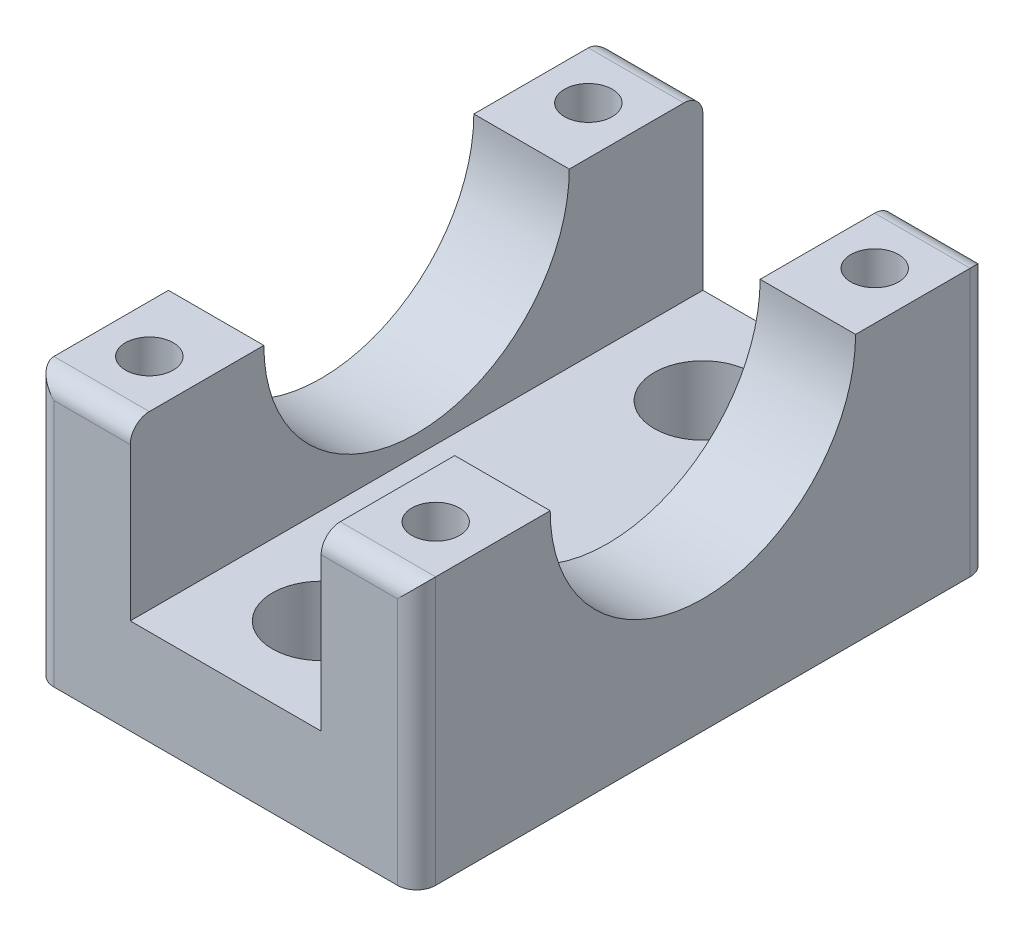
ISO-10303-21;
HEADER;
FILE_DESCRIPTION(('STEP AP214'),'2;1');
FILE_NAME('part.step','',(''),(''),'','','');
FILE_SCHEMA(('AUTOMOTIVE_DESIGN { 1 0 10303 214 1 1 1 1 }'));
ENDSEC;
DATA;
#1=APPLICATION_CONTEXT('core data for automotive mechanical design processes');
#2=APPLICATION_PROTOCOL_DEFINITION('international standard','automotive_design',2000,#1);
#3=PRODUCT_CONTEXT('',#1,'mechanical');
#4=PRODUCT('Part','Part','',(#3));
#5=PRODUCT_RELATED_PRODUCT_CATEGORY('part','',(#4));
#6=PRODUCT_DEFINITION_FORMATION('','',#4);
#7=PRODUCT_DEFINITION_CONTEXT('part definition',#1,'design');
#8=PRODUCT_DEFINITION('design','',#6,#7);
#9=PRODUCT_DEFINITION_SHAPE('','',#8);
#10=(LENGTH_UNIT() NAMED_UNIT(*) SI_UNIT(.MILLI.,.METRE.));
#11=(NAMED_UNIT(*) PLANE_ANGLE_UNIT() SI_UNIT($,.RADIAN.));
#12=(NAMED_UNIT(*) SI_UNIT($,.STERADIAN.) SOLID_ANGLE_UNIT());
#13=UNCERTAINTY_MEASURE_WITH_UNIT(LENGTH_MEASURE(1.E-05),#10,'distance_accuracy_value','');
#14=(GEOMETRIC_REPRESENTATION_CONTEXT(3) GLOBAL_UNCERTAINTY_ASSIGNED_CONTEXT((#13)) GLOBAL_UNIT_ASSIGNED_CONTEXT((#10,
#11,#12)) REPRESENTATION_CONTEXT('',''));
#15=CARTESIAN_POINT('',(0.,0.,0.));
#16=DIRECTION('',(0.,0.,1.));
#17=DIRECTION('',(1.,0.,0.));
#18=AXIS2_PLACEMENT_3D('',#15,#16,#17);
#19=CARTESIAN_POINT('',(0.,14.,0.));
#20=DIRECTION('',(0.,-1.,0.));
#21=DIRECTION('',(0.,0.,-1.));
#22=AXIS2_PLACEMENT_3D('',#19,#20,#21);
#23=PLANE('',#22);
#24=DIRECTION('',(0.,0.,-1.));
#25=VECTOR('',#24,1.);
#26=CARTESIAN_POINT('',(5.,14.,15.));
#27=LINE('',#26,#25);
#28=CARTESIAN_POINT('',(5.,14.,14.));
#29=VERTEX_POINT('',#28);
#30=CARTESIAN_POINT('',(5.,14.,8.));
#31=VERTEX_POINT('',#30);
#32=EDGE_CURVE('E196',#29,#31,#27,.T.);
#33=ORIENTED_EDGE('',*,*,#32,.F.);
#34=DIRECTION('',(-1.,0.,0.));
#35=VECTOR('',#34,1.);
#36=CARTESIAN_POINT('',(0.,14.,14.));
#37=LINE('',#36,#35);
#38=CARTESIAN_POINT('',(10.,14.,14.));
#39=VERTEX_POINT('',#38);
#40=EDGE_CURVE('E44',#29,#39,#37,.F.);
#41=ORIENTED_EDGE('',*,*,#40,.T.);
#42=DIRECTION('',(0.,0.,1.));
#43=VECTOR('',#42,1.);
#44=CARTESIAN_POINT('',(10.,14.,15.));
#45=LINE('',#44,#43);
#46=CARTESIAN_POINT('',(10.,14.,8.));
#47=VERTEX_POINT('',#46);
#48=EDGE_CURVE('E182',#47,#39,#45,.T.);
#49=ORIENTED_EDGE('',*,*,#48,.F.);
#50=DIRECTION('',(1.,0.,0.));
#51=VECTOR('',#50,1.);
#52=CARTESIAN_POINT('',(-10.,14.,8.));
#53=LINE('',#52,#51);
#54=EDGE_CURVE('E165',#31,#47,#53,.T.);
#55=ORIENTED_EDGE('',*,*,#54,.F.);
#56=EDGE_LOOP('',(#33,#41,#49,#55));
#57=FACE_BOUND('',#56,.T.);
#58=CARTESIAN_POINT('',(7.5,14.,11.5));
#59=DIRECTION('',(0.,-1.,0.));
#60=DIRECTION('',(0.,0.,1.));
#61=AXIS2_PLACEMENT_3D('',#58,#59,#60);
#62=CIRCLE('',#61,1.25);
#63=CARTESIAN_POINT('',(7.5,14.,12.75));
#64=VERTEX_POINT('',#63);
#65=EDGE_CURVE('E286',#64,#64,#62,.T.);
#66=ORIENTED_EDGE('',*,*,#65,.T.);
#67=EDGE_LOOP('',(#66));
#68=FACE_BOUND('',#67,.T.);
#69=ADVANCED_FACE('F35',(#57,#68),#23,.F.);
#70=CARTESIAN_POINT('',(10.,14.,-14.));
#71=VERTEX_POINT('',#70);
#72=CARTESIAN_POINT('',(10.,14.,-8.));
#73=VERTEX_POINT('',#72);
#74=EDGE_CURVE('E184',#71,#73,#45,.T.);
#75=ORIENTED_EDGE('',*,*,#74,.F.);
#76=DIRECTION('',(1.,0.,0.));
#77=VECTOR('',#76,1.);
#78=CARTESIAN_POINT('',(0.,14.,-14.));
#79=LINE('',#78,#77);
#80=CARTESIAN_POINT('',(5.,14.,-14.));
#81=VERTEX_POINT('',#80);
#82=EDGE_CURVE('E60',#71,#81,#79,.F.);
#83=ORIENTED_EDGE('',*,*,#82,.T.);
#84=CARTESIAN_POINT('',(5.,14.,-8.));
#85=VERTEX_POINT('',#84);
#86=EDGE_CURVE('E191',#85,#81,#27,.T.);
#87=ORIENTED_EDGE('',*,*,#86,.F.);
#88=DIRECTION('',(1.,0.,0.));
#89=VECTOR('',#88,1.);
#90=CARTESIAN_POINT('',(-10.,14.,-8.));
#91=LINE('',#90,#89);
#92=EDGE_CURVE('E174',#73,#85,#91,.F.);
#93=ORIENTED_EDGE('',*,*,#92,.F.);
#94=EDGE_LOOP('',(#75,#83,#87,#93));
#95=FACE_BOUND('',#94,.T.);
#96=CARTESIAN_POINT('',(7.5,14.,-11.5));
#97=DIRECTION('',(0.,-1.,0.));
#98=DIRECTION('',(0.,0.,1.));
#99=AXIS2_PLACEMENT_3D('',#96,#97,#98);
#100=CIRCLE('',#99,1.25);
#101=CARTESIAN_POINT('',(7.5,14.,-10.25));
#102=VERTEX_POINT('',#101);
#103=EDGE_CURVE('E381',#102,#102,#100,.T.);
#104=ORIENTED_EDGE('',*,*,#103,.T.);
#105=EDGE_LOOP('',(#104));
#106=FACE_BOUND('',#105,.T.);
#107=ADVANCED_FACE('F375',(#95,#106),#23,.F.);
#108=CARTESIAN_POINT('',(10.,5.,15.));
#109=DIRECTION('',(-1.,0.,0.));
#110=DIRECTION('',(0.,0.,1.));
#111=AXIS2_PLACEMENT_3D('',#108,#109,#110);
#112=PLANE('',#111);
#113=DIRECTION('',(0.,0.,-1.));
#114=VECTOR('',#113,1.);
#115=CARTESIAN_POINT('',(10.,0.,15.));
#116=LINE('',#115,#114);
#117=CARTESIAN_POINT('',(10.,0.,14.));
#118=VERTEX_POINT('',#117);
#119=CARTESIAN_POINT('',(10.,0.,-14.));
#120=VERTEX_POINT('',#119);
#121=EDGE_CURVE('E342',#118,#120,#116,.T.);
#122=ORIENTED_EDGE('',*,*,#121,.T.);
#123=DIRECTION('',(0.,-1.,0.));
#124=VECTOR('',#123,1.);
#125=CARTESIAN_POINT('',(10.,5.,-14.));
#126=LINE('',#125,#124);
#127=EDGE_CURVE('E259',#120,#71,#126,.F.);
#128=ORIENTED_EDGE('',*,*,#127,.T.);
#129=ORIENTED_EDGE('',*,*,#74,.T.);
#130=CARTESIAN_POINT('',(10.,14.,0.));
#131=DIRECTION('',(-1.,0.,0.));
#132=DIRECTION('',(0.,0.,1.));
#133=AXIS2_PLACEMENT_3D('',#130,#131,#132);
#134=CIRCLE('',#133,8.);
#135=EDGE_CURVE('E168',#73,#47,#134,.T.);
#136=ORIENTED_EDGE('',*,*,#135,.T.);
#137=ORIENTED_EDGE('',*,*,#48,.T.);
#138=DIRECTION('',(0.,-1.,0.));
#139=VECTOR('',#138,1.);
#140=CARTESIAN_POINT('',(10.,5.,14.));
#141=LINE('',#140,#139);
#142=EDGE_CURVE('E257',#39,#118,#141,.T.);
#143=ORIENTED_EDGE('',*,*,#142,.T.);
#144=EDGE_LOOP('',(#122,#128,#129,#136,#137,#143));
#145=FACE_BOUND('',#144,.T.);
#146=ADVANCED_FACE('F180',(#145),#112,.F.);
#147=CARTESIAN_POINT('',(5.,14.,15.));
#148=DIRECTION('',(-1.,0.,0.));
#149=DIRECTION('',(0.,0.,1.));
#150=AXIS2_PLACEMENT_3D('',#147,#148,#149);
#151=PLANE('',#150);
#152=ORIENTED_EDGE('',*,*,#86,.T.);
#153=CARTESIAN_POINT('',(5.,13.,-14.));
#154=DIRECTION('',(-1.,0.,0.));
#155=DIRECTION('',(0.,0.,1.));
#156=AXIS2_PLACEMENT_3D('',#153,#154,#155);
#157=CIRCLE('',#156,1.);
#158=CARTESIAN_POINT('',(5.,13.,-15.));
#159=VERTEX_POINT('',#158);
#160=EDGE_CURVE('E280',#81,#159,#157,.T.);
#161=ORIENTED_EDGE('',*,*,#160,.T.);
#162=DIRECTION('',(0.,-1.,0.));
#163=VECTOR('',#162,1.);
#164=CARTESIAN_POINT('',(5.,14.,-15.));
#165=LINE('',#164,#163);
#166=CARTESIAN_POINT('',(5.,5.,-15.));
#167=VERTEX_POINT('',#166);
#168=EDGE_CURVE('E200',#159,#167,#165,.T.);
#169=ORIENTED_EDGE('',*,*,#168,.T.);
#170=DIRECTION('',(0.,0.,-1.));
#171=VECTOR('',#170,1.);
#172=CARTESIAN_POINT('',(5.,5.,15.));
#173=LINE('',#172,#171);
#174=CARTESIAN_POINT('',(5.,5.,15.));
#175=VERTEX_POINT('',#174);
#176=EDGE_CURVE('E189',#175,#167,#173,.T.);
#177=ORIENTED_EDGE('',*,*,#176,.F.);
#178=DIRECTION('',(0.,-1.,0.));
#179=VECTOR('',#178,1.);
#180=CARTESIAN_POINT('',(5.,14.,15.));
#181=LINE('',#180,#179);
#182=CARTESIAN_POINT('',(5.,13.,15.));
#183=VERTEX_POINT('',#182);
#184=EDGE_CURVE('E197',#183,#175,#181,.T.);
#185=ORIENTED_EDGE('',*,*,#184,.F.);
#186=CARTESIAN_POINT('',(5.,13.,14.));
#187=DIRECTION('',(-1.,0.,0.));
#188=DIRECTION('',(0.,0.,1.));
#189=AXIS2_PLACEMENT_3D('',#186,#187,#188);
#190=CIRCLE('',#189,1.);
#191=EDGE_CURVE('E52',#183,#29,#190,.T.);
#192=ORIENTED_EDGE('',*,*,#191,.T.);
#193=ORIENTED_EDGE('',*,*,#32,.T.);
#194=CARTESIAN_POINT('',(5.,14.,0.));
#195=DIRECTION('',(-1.,0.,0.));
#196=DIRECTION('',(0.,0.,1.));
#197=AXIS2_PLACEMENT_3D('',#194,#195,#196);
#198=CIRCLE('',#197,8.);
#199=EDGE_CURVE('E171',#31,#85,#198,.F.);
#200=ORIENTED_EDGE('',*,*,#199,.T.);
#201=EDGE_LOOP('',(#152,#161,#169,#177,#185,#192,#193,#200));
#202=FACE_BOUND('',#201,.T.);
#203=ADVANCED_FACE('F373',(#202),#151,.T.);
#204=CARTESIAN_POINT('',(0.,14.,0.));
#205=DIRECTION('',(0.,-1.,0.));
#206=DIRECTION('',(0.,0.,-1.));
#207=AXIS2_PLACEMENT_3D('',#204,#205,#206);
#208=PLANE('',#207);
#209=CARTESIAN_POINT('',(-7.5,14.,11.5));
#210=DIRECTION('',(0.,1.,0.));
#211=DIRECTION('',(0.,0.,1.));
#212=AXIS2_PLACEMENT_3D('',#209,#210,#211);
#213=CIRCLE('',#212,1.25);
#214=CARTESIAN_POINT('',(-7.5,14.,12.75));
#215=VERTEX_POINT('',#214);
#216=EDGE_CURVE('E202',#215,#215,#213,.T.);
#217=ORIENTED_EDGE('',*,*,#216,.F.);
#218=EDGE_LOOP('',(#217));
#219=FACE_BOUND('',#218,.T.);
#220=DIRECTION('',(0.,0.,1.));
#221=VECTOR('',#220,1.);
#222=CARTESIAN_POINT('',(-10.,14.,15.));
#223=LINE('',#222,#221);
#224=CARTESIAN_POINT('',(-10.,14.,8.));
#225=VERTEX_POINT('',#224);
#226=CARTESIAN_POINT('',(-10.,14.,14.));
#227=VERTEX_POINT('',#226);
#228=EDGE_CURVE('E223',#225,#227,#223,.T.);
#229=ORIENTED_EDGE('',*,*,#228,.T.);
#230=DIRECTION('',(1.,0.,0.));
#231=VECTOR('',#230,1.);
#232=CARTESIAN_POINT('',(0.,14.,14.));
#233=LINE('',#232,#231);
#234=CARTESIAN_POINT('',(-5.,14.,14.));
#235=VERTEX_POINT('',#234);
#236=EDGE_CURVE('E11',#227,#235,#233,.T.);
#237=ORIENTED_EDGE('',*,*,#236,.T.);
#238=DIRECTION('',(0.,0.,-1.));
#239=VECTOR('',#238,1.);
#240=CARTESIAN_POINT('',(-5.,14.,15.));
#241=LINE('',#240,#239);
#242=CARTESIAN_POINT('',(-5.,14.,8.));
#243=VERTEX_POINT('',#242);
#244=EDGE_CURVE('E224',#235,#243,#241,.T.);
#245=ORIENTED_EDGE('',*,*,#244,.T.);
#246=DIRECTION('',(-1.,0.,0.));
#247=VECTOR('',#246,1.);
#248=CARTESIAN_POINT('',(10.000025,14.,8.));
#249=LINE('',#248,#247);
#250=EDGE_CURVE('E175',#243,#225,#249,.T.);
#251=ORIENTED_EDGE('',*,*,#250,.T.);
#252=EDGE_LOOP('',(#229,#237,#245,#251));
#253=FACE_BOUND('',#252,.T.);
#254=ADVANCED_FACE('F308',(#219,#253),#208,.F.);
#255=CARTESIAN_POINT('',(0.,5.,0.));
#256=DIRECTION('',(0.,-1.,0.));
#257=DIRECTION('',(0.,0.,-1.));
#258=AXIS2_PLACEMENT_3D('',#255,#256,#257);
#259=PLANE('',#258);
#260=CARTESIAN_POINT('',(0.,5.,-10.));
#261=DIRECTION('',(0.,1.,0.));
#262=DIRECTION('',(0.,0.,1.));
#263=AXIS2_PLACEMENT_3D('',#260,#261,#262);
#264=CIRCLE('',#263,2.55);
#265=CARTESIAN_POINT('',(0.,5.,-7.45000000000001));
#266=VERTEX_POINT('',#265);
#267=EDGE_CURVE('E338',#266,#266,#264,.T.);
#268=ORIENTED_EDGE('',*,*,#267,.F.);
#269=EDGE_LOOP('',(#268));
#270=FACE_BOUND('',#269,.T.);
#271=CARTESIAN_POINT('',(0.,5.,10.));
#272=DIRECTION('',(0.,1.,0.));
#273=DIRECTION('',(0.,0.,1.));
#274=AXIS2_PLACEMENT_3D('',#271,#272,#273);
#275=CIRCLE('',#274,2.55);
#276=CARTESIAN_POINT('',(0.,5.,12.55));
#277=VERTEX_POINT('',#276);
#278=EDGE_CURVE('E263',#277,#277,#275,.T.);
#279=ORIENTED_EDGE('',*,*,#278,.F.);
#280=EDGE_LOOP('',(#279));
#281=FACE_BOUND('',#280,.T.);
#282=DIRECTION('',(1.,0.,0.));
#283=VECTOR('',#282,1.);
#284=CARTESIAN_POINT('',(-10.,5.,15.));
#285=LINE('',#284,#283);
#286=CARTESIAN_POINT('',(-5.,5.,15.));
#287=VERTEX_POINT('',#286);
#288=EDGE_CURVE('E235',#287,#175,#285,.T.);
#289=ORIENTED_EDGE('',*,*,#288,.T.);
#290=ORIENTED_EDGE('',*,*,#176,.T.);
#291=DIRECTION('',(-1.,0.,0.));
#292=VECTOR('',#291,1.);
#293=CARTESIAN_POINT('',(-10.,5.,-15.));
#294=LINE('',#293,#292);
#295=CARTESIAN_POINT('',(-5.,5.,-15.));
#296=VERTEX_POINT('',#295);
#297=EDGE_CURVE('E330',#167,#296,#294,.T.);
#298=ORIENTED_EDGE('',*,*,#297,.T.);
#299=DIRECTION('',(0.,0.,-1.));
#300=VECTOR('',#299,1.);
#301=CARTESIAN_POINT('',(-5.,5.,15.));
#302=LINE('',#301,#300);
#303=EDGE_CURVE('E219',#287,#296,#302,.T.);
#304=ORIENTED_EDGE('',*,*,#303,.F.);
#305=EDGE_LOOP('',(#289,#290,#298,#304));
#306=FACE_BOUND('',#305,.T.);
#307=ADVANCED_FACE('F449',(#270,#281,#306),#259,.F.);
#308=CARTESIAN_POINT('',(-10.,5.,-15.));
#309=DIRECTION('',(0.,0.,1.));
#310=DIRECTION('',(1.,0.,0.));
#311=AXIS2_PLACEMENT_3D('',#308,#309,#310);
#312=PLANE('',#311);
#313=DIRECTION('',(-1.,0.,0.));
#314=VECTOR('',#313,1.);
#315=CARTESIAN_POINT('',(-10.,0.,-15.));
#316=LINE('',#315,#314);
#317=CARTESIAN_POINT('',(9.,0.,-15.));
#318=VERTEX_POINT('',#317);
#319=CARTESIAN_POINT('',(-9.,0.,-15.));
#320=VERTEX_POINT('',#319);
#321=EDGE_CURVE('E344',#318,#320,#316,.T.);
#322=ORIENTED_EDGE('',*,*,#321,.T.);
#323=DIRECTION('',(0.,-1.,0.));
#324=VECTOR('',#323,1.);
#325=CARTESIAN_POINT('',(-9.,5.,-15.));
#326=LINE('',#325,#324);
#327=CARTESIAN_POINT('',(-9.,13.,-15.));
#328=VERTEX_POINT('',#327);
#329=EDGE_CURVE('E255',#320,#328,#326,.F.);
#330=ORIENTED_EDGE('',*,*,#329,.T.);
#331=DIRECTION('',(-1.,0.,0.));
#332=VECTOR('',#331,1.);
#333=CARTESIAN_POINT('',(-10.,13.,-15.));
#334=LINE('',#333,#332);
#335=CARTESIAN_POINT('',(-5.,13.,-15.));
#336=VERTEX_POINT('',#335);
#337=EDGE_CURVE('E253',#328,#336,#334,.F.);
#338=ORIENTED_EDGE('',*,*,#337,.T.);
#339=DIRECTION('',(0.,-1.,0.));
#340=VECTOR('',#339,1.);
#341=CARTESIAN_POINT('',(-5.,14.,-15.));
#342=LINE('',#341,#340);
#343=EDGE_CURVE('E226',#336,#296,#342,.T.);
#344=ORIENTED_EDGE('',*,*,#343,.T.);
#345=ORIENTED_EDGE('',*,*,#297,.F.);
#346=ORIENTED_EDGE('',*,*,#168,.F.);
#347=DIRECTION('',(1.,0.,0.));
#348=VECTOR('',#347,1.);
#349=CARTESIAN_POINT('',(-10.,13.,-15.));
#350=LINE('',#349,#348);
#351=CARTESIAN_POINT('',(9.,13.,-15.));
#352=VERTEX_POINT('',#351);
#353=EDGE_CURVE('E248',#159,#352,#350,.T.);
#354=ORIENTED_EDGE('',*,*,#353,.T.);
#355=DIRECTION('',(0.,-1.,0.));
#356=VECTOR('',#355,1.);
#357=CARTESIAN_POINT('',(9.,5.,-15.));
#358=LINE('',#357,#356);
#359=EDGE_CURVE('E250',#352,#318,#358,.T.);
#360=ORIENTED_EDGE('',*,*,#359,.T.);
#361=EDGE_LOOP('',(#322,#330,#338,#344,#345,#346,#354,#360));
#362=FACE_BOUND('',#361,.T.);
#363=ADVANCED_FACE('F452',(#362),#312,.F.);
#364=CARTESIAN_POINT('',(-10.,5.,15.));
#365=DIRECTION('',(1.,0.,0.));
#366=DIRECTION('',(0.,0.,-1.));
#367=AXIS2_PLACEMENT_3D('',#364,#365,#366);
#368=PLANE('',#367);
#369=CARTESIAN_POINT('',(-10.,14.,-14.));
#370=VERTEX_POINT('',#369);
#371=CARTESIAN_POINT('',(-10.,14.,-8.));
#372=VERTEX_POINT('',#371);
#373=EDGE_CURVE('E220',#370,#372,#223,.T.);
#374=ORIENTED_EDGE('',*,*,#373,.F.);
#375=DIRECTION('',(0.,-1.,0.));
#376=VECTOR('',#375,1.);
#377=CARTESIAN_POINT('',(-10.,5.,-14.));
#378=LINE('',#377,#376);
#379=CARTESIAN_POINT('',(-10.,0.,-14.));
#380=VERTEX_POINT('',#379);
#381=EDGE_CURVE('E370',#370,#380,#378,.T.);
#382=ORIENTED_EDGE('',*,*,#381,.T.);
#383=DIRECTION('',(0.,0.,1.));
#384=VECTOR('',#383,1.);
#385=CARTESIAN_POINT('',(-10.,0.,15.));
#386=LINE('',#385,#384);
#387=CARTESIAN_POINT('',(-10.,0.,14.));
#388=VERTEX_POINT('',#387);
#389=EDGE_CURVE('E348',#380,#388,#386,.T.);
#390=ORIENTED_EDGE('',*,*,#389,.T.);
#391=DIRECTION('',(0.,-1.,0.));
#392=VECTOR('',#391,1.);
#393=CARTESIAN_POINT('',(-10.,5.,14.));
#394=LINE('',#393,#392);
#395=EDGE_CURVE('E300',#388,#227,#394,.F.);
#396=ORIENTED_EDGE('',*,*,#395,.T.);
#397=ORIENTED_EDGE('',*,*,#228,.F.);
#398=CARTESIAN_POINT('',(-10.,14.,0.));
#399=DIRECTION('',(-1.,0.,0.));
#400=DIRECTION('',(0.,0.,1.));
#401=AXIS2_PLACEMENT_3D('',#398,#399,#400);
#402=CIRCLE('',#401,8.);
#403=EDGE_CURVE('E212',#372,#225,#402,.T.);
#404=ORIENTED_EDGE('',*,*,#403,.F.);
#405=EDGE_LOOP('',(#374,#382,#390,#396,#397,#404));
#406=FACE_BOUND('',#405,.T.);
#407=ADVANCED_FACE('F459',(#406),#368,.F.);
#408=CARTESIAN_POINT('',(-10.,5.,15.));
#409=DIRECTION('',(0.,0.,-1.));
#410=DIRECTION('',(-1.,0.,0.));
#411=AXIS2_PLACEMENT_3D('',#408,#409,#410);
#412=PLANE('',#411);
#413=DIRECTION('',(1.,0.,0.));
#414=VECTOR('',#413,1.);
#415=CARTESIAN_POINT('',(-10.,0.,15.));
#416=LINE('',#415,#414);
#417=CARTESIAN_POINT('',(-9.,0.,15.));
#418=VERTEX_POINT('',#417);
#419=CARTESIAN_POINT('',(9.,0.,15.));
#420=VERTEX_POINT('',#419);
#421=EDGE_CURVE('E334',#418,#420,#416,.T.);
#422=ORIENTED_EDGE('',*,*,#421,.T.);
#423=DIRECTION('',(0.,-1.,0.));
#424=VECTOR('',#423,1.);
#425=CARTESIAN_POINT('',(9.,5.,15.));
#426=LINE('',#425,#424);
#427=CARTESIAN_POINT('',(9.,13.,15.));
#428=VERTEX_POINT('',#427);
#429=EDGE_CURVE('E270',#420,#428,#426,.F.);
#430=ORIENTED_EDGE('',*,*,#429,.T.);
#431=DIRECTION('',(-1.,0.,0.));
#432=VECTOR('',#431,1.);
#433=CARTESIAN_POINT('',(-10.,13.,15.));
#434=LINE('',#433,#432);
#435=EDGE_CURVE('E268',#428,#183,#434,.T.);
#436=ORIENTED_EDGE('',*,*,#435,.T.);
#437=ORIENTED_EDGE('',*,*,#184,.T.);
#438=ORIENTED_EDGE('',*,*,#288,.F.);
#439=DIRECTION('',(0.,-1.,0.));
#440=VECTOR('',#439,1.);
#441=CARTESIAN_POINT('',(-5.,14.,15.));
#442=LINE('',#441,#440);
#443=CARTESIAN_POINT('',(-5.,13.,15.));
#444=VERTEX_POINT('',#443);
#445=EDGE_CURVE('E245',#444,#287,#442,.T.);
#446=ORIENTED_EDGE('',*,*,#445,.F.);
#447=DIRECTION('',(1.,0.,0.));
#448=VECTOR('',#447,1.);
#449=CARTESIAN_POINT('',(-10.,13.,15.));
#450=LINE('',#449,#448);
#451=CARTESIAN_POINT('',(-9.,13.,15.));
#452=VERTEX_POINT('',#451);
#453=EDGE_CURVE('E261',#444,#452,#450,.F.);
#454=ORIENTED_EDGE('',*,*,#453,.T.);
#455=DIRECTION('',(0.,-1.,0.));
#456=VECTOR('',#455,1.);
#457=CARTESIAN_POINT('',(-9.,5.,15.));
#458=LINE('',#457,#456);
#459=EDGE_CURVE('E265',#452,#418,#458,.T.);
#460=ORIENTED_EDGE('',*,*,#459,.T.);
#461=EDGE_LOOP('',(#422,#430,#436,#437,#438,#446,#454,#460));
#462=FACE_BOUND('',#461,.T.);
#463=ADVANCED_FACE('F353',(#462),#412,.F.);
#464=CARTESIAN_POINT('',(0.,0.,0.));
#465=DIRECTION('',(0.,-1.,0.));
#466=DIRECTION('',(0.,0.,-1.));
#467=AXIS2_PLACEMENT_3D('',#464,#465,#466);
#468=PLANE('',#467);
#469=CARTESIAN_POINT('',(0.,0.,10.));
#470=DIRECTION('',(0.,1.,0.));
#471=DIRECTION('',(0.,0.,1.));
#472=AXIS2_PLACEMENT_3D('',#469,#470,#471);
#473=CIRCLE('',#472,2.55);
#474=CARTESIAN_POINT('',(0.,0.,12.55));
#475=VERTEX_POINT('',#474);
#476=EDGE_CURVE('E229',#475,#475,#473,.T.);
#477=ORIENTED_EDGE('',*,*,#476,.T.);
#478=EDGE_LOOP('',(#477));
#479=FACE_BOUND('',#478,.T.);
#480=CARTESIAN_POINT('',(0.,0.,-10.));
#481=DIRECTION('',(0.,1.,0.));
#482=DIRECTION('',(0.,0.,1.));
#483=AXIS2_PLACEMENT_3D('',#480,#481,#482);
#484=CIRCLE('',#483,2.55);
#485=CARTESIAN_POINT('',(0.,0.,-7.45000000000001));
#486=VERTEX_POINT('',#485);
#487=EDGE_CURVE('E345',#486,#486,#484,.T.);
#488=ORIENTED_EDGE('',*,*,#487,.T.);
#489=EDGE_LOOP('',(#488));
#490=FACE_BOUND('',#489,.T.);
#491=ORIENTED_EDGE('',*,*,#389,.F.);
#492=CARTESIAN_POINT('',(-9.,0.,-14.));
#493=DIRECTION('',(0.,-1.,0.));
#494=DIRECTION('',(0.,0.,-1.));
#495=AXIS2_PLACEMENT_3D('',#492,#493,#494);
#496=CIRCLE('',#495,1.);
#497=EDGE_CURVE('E246',#380,#320,#496,.T.);
#498=ORIENTED_EDGE('',*,*,#497,.T.);
#499=ORIENTED_EDGE('',*,*,#321,.F.);
#500=CARTESIAN_POINT('',(9.,0.,-14.));
#501=DIRECTION('',(0.,-1.,0.));
#502=DIRECTION('',(0.,0.,-1.));
#503=AXIS2_PLACEMENT_3D('',#500,#501,#502);
#504=CIRCLE('',#503,1.);
#505=EDGE_CURVE('E359',#318,#120,#504,.T.);
#506=ORIENTED_EDGE('',*,*,#505,.T.);
#507=ORIENTED_EDGE('',*,*,#121,.F.);
#508=CARTESIAN_POINT('',(9.,0.,14.));
#509=DIRECTION('',(0.,-1.,0.));
#510=DIRECTION('',(0.,0.,-1.));
#511=AXIS2_PLACEMENT_3D('',#508,#509,#510);
#512=CIRCLE('',#511,1.);
#513=EDGE_CURVE('E357',#118,#420,#512,.T.);
#514=ORIENTED_EDGE('',*,*,#513,.T.);
#515=ORIENTED_EDGE('',*,*,#421,.F.);
#516=CARTESIAN_POINT('',(-9.,0.,14.));
#517=DIRECTION('',(0.,-1.,0.));
#518=DIRECTION('',(0.,0.,-1.));
#519=AXIS2_PLACEMENT_3D('',#516,#517,#518);
#520=CIRCLE('',#519,1.);
#521=EDGE_CURVE('E360',#418,#388,#520,.T.);
#522=ORIENTED_EDGE('',*,*,#521,.T.);
#523=EDGE_LOOP('',(#491,#498,#499,#506,#507,#514,#515,#522));
#524=FACE_BOUND('',#523,.T.);
#525=ADVANCED_FACE('F364',(#479,#490,#524),#468,.T.);
#526=CARTESIAN_POINT('',(0.,0.,-10.));
#527=DIRECTION('',(0.,1.,0.));
#528=DIRECTION('',(0.,0.,1.));
#529=AXIS2_PLACEMENT_3D('',#526,#527,#528);
#530=CYLINDRICAL_SURFACE('',#529,2.55);
#531=ORIENTED_EDGE('',*,*,#487,.F.);
#532=EDGE_LOOP('',(#531));
#533=FACE_BOUND('',#532,.T.);
#534=ORIENTED_EDGE('',*,*,#267,.T.);
#535=EDGE_LOOP('',(#534));
#536=FACE_BOUND('',#535,.T.);
#537=ADVANCED_FACE('F444',(#533,#536),#530,.F.);
#538=CARTESIAN_POINT('',(0.,0.,10.));
#539=DIRECTION('',(0.,1.,0.));
#540=DIRECTION('',(0.,0.,1.));
#541=AXIS2_PLACEMENT_3D('',#538,#539,#540);
#542=CYLINDRICAL_SURFACE('',#541,2.55);
#543=ORIENTED_EDGE('',*,*,#476,.F.);
#544=EDGE_LOOP('',(#543));
#545=FACE_BOUND('',#544,.T.);
#546=ORIENTED_EDGE('',*,*,#278,.T.);
#547=EDGE_LOOP('',(#546));
#548=FACE_BOUND('',#547,.T.);
#549=ADVANCED_FACE('F441',(#545,#548),#542,.F.);
#550=CARTESIAN_POINT('',(-5.,14.,15.));
#551=DIRECTION('',(-1.,0.,0.));
#552=DIRECTION('',(0.,0.,1.));
#553=AXIS2_PLACEMENT_3D('',#550,#551,#552);
#554=PLANE('',#553);
#555=ORIENTED_EDGE('',*,*,#343,.F.);
#556=CARTESIAN_POINT('',(-5.,13.,-14.));
#557=DIRECTION('',(-1.,0.,0.));
#558=DIRECTION('',(0.,0.,1.));
#559=AXIS2_PLACEMENT_3D('',#556,#557,#558);
#560=CIRCLE('',#559,1.);
#561=CARTESIAN_POINT('',(-5.,14.,-14.));
#562=VERTEX_POINT('',#561);
#563=EDGE_CURVE('E276',#336,#562,#560,.F.);
#564=ORIENTED_EDGE('',*,*,#563,.T.);
#565=CARTESIAN_POINT('',(-5.,14.,-8.));
#566=VERTEX_POINT('',#565);
#567=EDGE_CURVE('E222',#566,#562,#241,.T.);
#568=ORIENTED_EDGE('',*,*,#567,.F.);
#569=CARTESIAN_POINT('',(-5.,14.,0.));
#570=DIRECTION('',(-1.,0.,0.));
#571=DIRECTION('',(0.,0.,1.));
#572=AXIS2_PLACEMENT_3D('',#569,#570,#571);
#573=CIRCLE('',#572,8.);
#574=EDGE_CURVE('E216',#566,#243,#573,.T.);
#575=ORIENTED_EDGE('',*,*,#574,.T.);
#576=ORIENTED_EDGE('',*,*,#244,.F.);
#577=CARTESIAN_POINT('',(-5.,13.,14.));
#578=DIRECTION('',(-1.,0.,0.));
#579=DIRECTION('',(0.,0.,1.));
#580=AXIS2_PLACEMENT_3D('',#577,#578,#579);
#581=CIRCLE('',#580,1.);
#582=EDGE_CURVE('E274',#235,#444,#581,.F.);
#583=ORIENTED_EDGE('',*,*,#582,.T.);
#584=ORIENTED_EDGE('',*,*,#445,.T.);
#585=ORIENTED_EDGE('',*,*,#303,.T.);
#586=EDGE_LOOP('',(#555,#564,#568,#575,#576,#583,#584,#585));
#587=FACE_BOUND('',#586,.T.);
#588=ADVANCED_FACE('F314',(#587),#554,.F.);
#589=CARTESIAN_POINT('',(-7.5,14.,-11.5));
#590=DIRECTION('',(0.,1.,0.));
#591=DIRECTION('',(0.,0.,1.));
#592=AXIS2_PLACEMENT_3D('',#589,#590,#591);
#593=CIRCLE('',#592,1.25);
#594=CARTESIAN_POINT('',(-7.5,14.,-10.25));
#595=VERTEX_POINT('',#594);
#596=EDGE_CURVE('E206',#595,#595,#593,.T.);
#597=ORIENTED_EDGE('',*,*,#596,.F.);
#598=EDGE_LOOP('',(#597));
#599=FACE_BOUND('',#598,.T.);
#600=ORIENTED_EDGE('',*,*,#567,.T.);
#601=DIRECTION('',(-1.,0.,0.));
#602=VECTOR('',#601,1.);
#603=CARTESIAN_POINT('',(0.,14.,-14.));
#604=LINE('',#603,#602);
#605=EDGE_CURVE('E272',#562,#370,#604,.T.);
#606=ORIENTED_EDGE('',*,*,#605,.T.);
#607=ORIENTED_EDGE('',*,*,#373,.T.);
#608=DIRECTION('',(-1.,0.,0.));
#609=VECTOR('',#608,1.);
#610=CARTESIAN_POINT('',(10.000025,14.,-8.));
#611=LINE('',#610,#609);
#612=EDGE_CURVE('E322',#372,#566,#611,.F.);
#613=ORIENTED_EDGE('',*,*,#612,.T.);
#614=EDGE_LOOP('',(#600,#606,#607,#613));
#615=FACE_BOUND('',#614,.T.);
#616=ADVANCED_FACE('F325',(#599,#615),#208,.F.);
#617=CARTESIAN_POINT('',(10.000025,14.,0.));
#618=DIRECTION('',(-1.,0.,0.));
#619=DIRECTION('',(0.,0.,1.));
#620=AXIS2_PLACEMENT_3D('',#617,#618,#619);
#621=CYLINDRICAL_SURFACE('',#620,8.);
#622=ORIENTED_EDGE('',*,*,#574,.F.);
#623=ORIENTED_EDGE('',*,*,#612,.F.);
#624=ORIENTED_EDGE('',*,*,#403,.T.);
#625=ORIENTED_EDGE('',*,*,#250,.F.);
#626=EDGE_LOOP('',(#622,#623,#624,#625));
#627=FACE_BOUND('',#626,.T.);
#628=ADVANCED_FACE('F321',(#627),#621,.F.);
#629=CARTESIAN_POINT('',(-7.5,4.,-11.5));
#630=DIRECTION('',(0.,1.,0.));
#631=DIRECTION('',(0.,0.,1.));
#632=AXIS2_PLACEMENT_3D('',#629,#630,#631);
#633=CYLINDRICAL_SURFACE('',#632,1.25);
#634=CARTESIAN_POINT('',(-7.5,4.,-11.5));
#635=DIRECTION('',(0.,1.,0.));
#636=DIRECTION('',(0.,0.,1.));
#637=AXIS2_PLACEMENT_3D('',#634,#635,#636);
#638=CIRCLE('',#637,1.25);
#639=CARTESIAN_POINT('',(-7.5,4.,-10.25));
#640=VERTEX_POINT('',#639);
#641=EDGE_CURVE('E209',#640,#640,#638,.T.);
#642=ORIENTED_EDGE('',*,*,#641,.F.);
#643=EDGE_LOOP('',(#642));
#644=FACE_BOUND('',#643,.T.);
#645=ORIENTED_EDGE('',*,*,#596,.T.);
#646=EDGE_LOOP('',(#645));
#647=FACE_BOUND('',#646,.T.);
#648=ADVANCED_FACE('F429',(#644,#647),#633,.F.);
#649=CARTESIAN_POINT('',(-7.5,4.,-11.5));
#650=DIRECTION('',(0.,1.,0.));
#651=DIRECTION('',(0.,0.,1.));
#652=AXIS2_PLACEMENT_3D('',#649,#650,#651);
#653=PLANE('',#652);
#654=ORIENTED_EDGE('',*,*,#641,.T.);
#655=EDGE_LOOP('',(#654));
#656=FACE_BOUND('',#655,.T.);
#657=ADVANCED_FACE('F425',(#656),#653,.T.);
#658=CARTESIAN_POINT('',(-7.5,4.,11.5));
#659=DIRECTION('',(0.,1.,0.));
#660=DIRECTION('',(0.,0.,1.));
#661=AXIS2_PLACEMENT_3D('',#658,#659,#660);
#662=CYLINDRICAL_SURFACE('',#661,1.25);
#663=CARTESIAN_POINT('',(-7.5,4.,11.5));
#664=DIRECTION('',(0.,1.,0.));
#665=DIRECTION('',(0.,0.,1.));
#666=AXIS2_PLACEMENT_3D('',#663,#664,#665);
#667=CIRCLE('',#666,1.25);
#668=CARTESIAN_POINT('',(-7.5,4.,12.75));
#669=VERTEX_POINT('',#668);
#670=EDGE_CURVE('E203',#669,#669,#667,.T.);
#671=ORIENTED_EDGE('',*,*,#670,.F.);
#672=EDGE_LOOP('',(#671));
#673=FACE_BOUND('',#672,.T.);
#674=ORIENTED_EDGE('',*,*,#216,.T.);
#675=EDGE_LOOP('',(#674));
#676=FACE_BOUND('',#675,.T.);
#677=ADVANCED_FACE('F421',(#673,#676),#662,.F.);
#678=CARTESIAN_POINT('',(-7.5,4.,11.5));
#679=DIRECTION('',(0.,1.,0.));
#680=DIRECTION('',(0.,0.,1.));
#681=AXIS2_PLACEMENT_3D('',#678,#679,#680);
#682=PLANE('',#681);
#683=ORIENTED_EDGE('',*,*,#670,.T.);
#684=EDGE_LOOP('',(#683));
#685=FACE_BOUND('',#684,.T.);
#686=ADVANCED_FACE('F418',(#685),#682,.T.);
#687=CARTESIAN_POINT('',(-10.,14.,0.));
#688=DIRECTION('',(1.,0.,0.));
#689=DIRECTION('',(0.,0.,-1.));
#690=AXIS2_PLACEMENT_3D('',#687,#688,#689);
#691=CYLINDRICAL_SURFACE('',#690,8.);
#692=ORIENTED_EDGE('',*,*,#92,.T.);
#693=ORIENTED_EDGE('',*,*,#199,.F.);
#694=ORIENTED_EDGE('',*,*,#54,.T.);
#695=ORIENTED_EDGE('',*,*,#135,.F.);
#696=EDGE_LOOP('',(#692,#693,#694,#695));
#697=FACE_BOUND('',#696,.T.);
#698=ADVANCED_FACE('F167',(#697),#691,.F.);
#699=CARTESIAN_POINT('',(7.5,4.,-11.5));
#700=DIRECTION('',(0.,1.,0.));
#701=DIRECTION('',(0.,0.,1.));
#702=AXIS2_PLACEMENT_3D('',#699,#700,#701);
#703=CYLINDRICAL_SURFACE('',#702,1.25);
#704=CARTESIAN_POINT('',(7.5,4.,-11.5));
#705=DIRECTION('',(0.,-1.,0.));
#706=DIRECTION('',(0.,0.,1.));
#707=AXIS2_PLACEMENT_3D('',#704,#705,#706);
#708=CIRCLE('',#707,1.25);
#709=CARTESIAN_POINT('',(7.5,4.,-10.25));
#710=VERTEX_POINT('',#709);
#711=EDGE_CURVE('E185',#710,#710,#708,.T.);
#712=ORIENTED_EDGE('',*,*,#711,.T.);
#713=EDGE_LOOP('',(#712));
#714=FACE_BOUND('',#713,.T.);
#715=ORIENTED_EDGE('',*,*,#103,.F.);
#716=EDGE_LOOP('',(#715));
#717=FACE_BOUND('',#716,.T.);
#718=ADVANCED_FACE('F406',(#714,#717),#703,.F.);
#719=CARTESIAN_POINT('',(7.5,4.,-11.5));
#720=DIRECTION('',(0.,1.,0.));
#721=DIRECTION('',(0.,0.,1.));
#722=AXIS2_PLACEMENT_3D('',#719,#720,#721);
#723=PLANE('',#722);
#724=ORIENTED_EDGE('',*,*,#711,.F.);
#725=EDGE_LOOP('',(#724));
#726=FACE_BOUND('',#725,.T.);
#727=ADVANCED_FACE('F396',(#726),#723,.T.);
#728=CARTESIAN_POINT('',(7.5,4.,11.5));
#729=DIRECTION('',(0.,1.,0.));
#730=DIRECTION('',(0.,0.,1.));
#731=AXIS2_PLACEMENT_3D('',#728,#729,#730);
#732=CYLINDRICAL_SURFACE('',#731,1.25);
#733=CARTESIAN_POINT('',(7.5,4.,11.5));
#734=DIRECTION('',(0.,-1.,0.));
#735=DIRECTION('',(0.,0.,1.));
#736=AXIS2_PLACEMENT_3D('',#733,#734,#735);
#737=CIRCLE('',#736,1.25);
#738=CARTESIAN_POINT('',(7.5,4.,12.75));
#739=VERTEX_POINT('',#738);
#740=EDGE_CURVE('E383',#739,#739,#737,.T.);
#741=ORIENTED_EDGE('',*,*,#740,.T.);
#742=EDGE_LOOP('',(#741));
#743=FACE_BOUND('',#742,.T.);
#744=ORIENTED_EDGE('',*,*,#65,.F.);
#745=EDGE_LOOP('',(#744));
#746=FACE_BOUND('',#745,.T.);
#747=ADVANCED_FACE('F393',(#743,#746),#732,.F.);
#748=CARTESIAN_POINT('',(7.5,4.,11.5));
#749=DIRECTION('',(0.,1.,0.));
#750=DIRECTION('',(0.,0.,1.));
#751=AXIS2_PLACEMENT_3D('',#748,#749,#750);
#752=PLANE('',#751);
#753=ORIENTED_EDGE('',*,*,#740,.F.);
#754=EDGE_LOOP('',(#753));
#755=FACE_BOUND('',#754,.T.);
#756=ADVANCED_FACE('F395',(#755),#752,.T.);
#757=CARTESIAN_POINT('',(0.,13.,-14.));
#758=DIRECTION('',(-1.,0.,0.));
#759=DIRECTION('',(0.,0.,1.));
#760=AXIS2_PLACEMENT_3D('',#757,#758,#759);
#761=CYLINDRICAL_SURFACE('',#760,1.);
#762=ORIENTED_EDGE('',*,*,#563,.F.);
#763=ORIENTED_EDGE('',*,*,#337,.F.);
#764=CARTESIAN_POINT('',(-9.,13.,-14.));
#765=DIRECTION('',(-0.707106781186547,-0.707106781186547,0.));
#766=DIRECTION('',(-0.707106781186547,0.707106781186547,0.));
#767=AXIS2_PLACEMENT_3D('',#764,#765,#766);
#768=ELLIPSE('',#767,1.41421356237309,1.);
#769=EDGE_CURVE('E283',#370,#328,#768,.T.);
#770=ORIENTED_EDGE('',*,*,#769,.F.);
#771=ORIENTED_EDGE('',*,*,#605,.F.);
#772=EDGE_LOOP('',(#762,#763,#770,#771));
#773=FACE_BOUND('',#772,.T.);
#774=ADVANCED_FACE('F403',(#773),#761,.T.);
#775=CARTESIAN_POINT('',(-9.,5.,-14.));
#776=DIRECTION('',(0.,-1.,0.));
#777=DIRECTION('',(0.,0.,-1.));
#778=AXIS2_PLACEMENT_3D('',#775,#776,#777);
#779=CYLINDRICAL_SURFACE('',#778,1.);
#780=ORIENTED_EDGE('',*,*,#769,.T.);
#781=ORIENTED_EDGE('',*,*,#329,.F.);
#782=ORIENTED_EDGE('',*,*,#497,.F.);
#783=ORIENTED_EDGE('',*,*,#381,.F.);
#784=EDGE_LOOP('',(#780,#781,#782,#783));
#785=FACE_BOUND('',#784,.T.);
#786=ADVANCED_FACE('F468',(#785),#779,.T.);
#787=CARTESIAN_POINT('',(-10.,13.,-14.));
#788=DIRECTION('',(1.,0.,0.));
#789=DIRECTION('',(0.,0.,-1.));
#790=AXIS2_PLACEMENT_3D('',#787,#788,#789);
#791=CYLINDRICAL_SURFACE('',#790,1.);
#792=ORIENTED_EDGE('',*,*,#160,.F.);
#793=ORIENTED_EDGE('',*,*,#82,.F.);
#794=CARTESIAN_POINT('',(9.,13.,-14.));
#795=DIRECTION('',(0.707106781186547,-0.707106781186547,0.));
#796=DIRECTION('',(0.707106781186547,0.707106781186547,0.));
#797=AXIS2_PLACEMENT_3D('',#794,#795,#796);
#798=ELLIPSE('',#797,1.41421356237309,1.);
#799=EDGE_CURVE('E287',#352,#71,#798,.T.);
#800=ORIENTED_EDGE('',*,*,#799,.F.);
#801=ORIENTED_EDGE('',*,*,#353,.F.);
#802=EDGE_LOOP('',(#792,#793,#800,#801));
#803=FACE_BOUND('',#802,.T.);
#804=ADVANCED_FACE('F471',(#803),#791,.T.);
#805=CARTESIAN_POINT('',(9.,5.,-14.));
#806=DIRECTION('',(0.,-1.,0.));
#807=DIRECTION('',(0.,0.,-1.));
#808=AXIS2_PLACEMENT_3D('',#805,#806,#807);
#809=CYLINDRICAL_SURFACE('',#808,1.);
#810=ORIENTED_EDGE('',*,*,#799,.T.);
#811=ORIENTED_EDGE('',*,*,#127,.F.);
#812=ORIENTED_EDGE('',*,*,#505,.F.);
#813=ORIENTED_EDGE('',*,*,#359,.F.);
#814=EDGE_LOOP('',(#810,#811,#812,#813));
#815=FACE_BOUND('',#814,.T.);
#816=ADVANCED_FACE('F476',(#815),#809,.T.);
#817=CARTESIAN_POINT('',(-10.,13.,14.));
#818=DIRECTION('',(-1.,0.,0.));
#819=DIRECTION('',(0.,0.,1.));
#820=AXIS2_PLACEMENT_3D('',#817,#818,#819);
#821=CYLINDRICAL_SURFACE('',#820,1.);
#822=ORIENTED_EDGE('',*,*,#191,.F.);
#823=ORIENTED_EDGE('',*,*,#435,.F.);
#824=CARTESIAN_POINT('',(9.,13.,14.));
#825=DIRECTION('',(-0.707106781186547,0.707106781186547,0.));
#826=DIRECTION('',(-0.707106781186547,-0.707106781186547,0.));
#827=AXIS2_PLACEMENT_3D('',#824,#825,#826);
#828=ELLIPSE('',#827,1.41421356237309,1.);
#829=EDGE_CURVE('E289',#39,#428,#828,.F.);
#830=ORIENTED_EDGE('',*,*,#829,.F.);
#831=ORIENTED_EDGE('',*,*,#40,.F.);
#832=EDGE_LOOP('',(#822,#823,#830,#831));
#833=FACE_BOUND('',#832,.T.);
#834=ADVANCED_FACE('F479',(#833),#821,.T.);
#835=CARTESIAN_POINT('',(9.,5.,14.));
#836=DIRECTION('',(0.,-1.,0.));
#837=DIRECTION('',(0.,0.,-1.));
#838=AXIS2_PLACEMENT_3D('',#835,#836,#837);
#839=CYLINDRICAL_SURFACE('',#838,1.);
#840=ORIENTED_EDGE('',*,*,#829,.T.);
#841=ORIENTED_EDGE('',*,*,#429,.F.);
#842=ORIENTED_EDGE('',*,*,#513,.F.);
#843=ORIENTED_EDGE('',*,*,#142,.F.);
#844=EDGE_LOOP('',(#840,#841,#842,#843));
#845=FACE_BOUND('',#844,.T.);
#846=ADVANCED_FACE('F356',(#845),#839,.T.);
#847=CARTESIAN_POINT('',(0.,13.,14.));
#848=DIRECTION('',(1.,0.,0.));
#849=DIRECTION('',(0.,0.,-1.));
#850=AXIS2_PLACEMENT_3D('',#847,#848,#849);
#851=CYLINDRICAL_SURFACE('',#850,1.);
#852=ORIENTED_EDGE('',*,*,#582,.F.);
#853=ORIENTED_EDGE('',*,*,#236,.F.);
#854=CARTESIAN_POINT('',(-9.,13.,14.));
#855=DIRECTION('',(0.707106781186547,0.707106781186547,0.));
#856=DIRECTION('',(0.707106781186547,-0.707106781186547,0.));
#857=AXIS2_PLACEMENT_3D('',#854,#855,#856);
#858=ELLIPSE('',#857,1.41421356237309,1.);
#859=EDGE_CURVE('E39',#452,#227,#858,.F.);
#860=ORIENTED_EDGE('',*,*,#859,.F.);
#861=ORIENTED_EDGE('',*,*,#453,.F.);
#862=EDGE_LOOP('',(#852,#853,#860,#861));
#863=FACE_BOUND('',#862,.T.);
#864=ADVANCED_FACE('F37',(#863),#851,.T.);
#865=CARTESIAN_POINT('',(-9.,5.,14.));
#866=DIRECTION('',(0.,-1.,0.));
#867=DIRECTION('',(0.,0.,-1.));
#868=AXIS2_PLACEMENT_3D('',#865,#866,#867);
#869=CYLINDRICAL_SURFACE('',#868,1.);
#870=ORIENTED_EDGE('',*,*,#859,.T.);
#871=ORIENTED_EDGE('',*,*,#395,.F.);
#872=ORIENTED_EDGE('',*,*,#521,.F.);
#873=ORIENTED_EDGE('',*,*,#459,.F.);
#874=EDGE_LOOP('',(#870,#871,#872,#873));
#875=FACE_BOUND('',#874,.T.);
#876=ADVANCED_FACE('F299',(#875),#869,.T.);
#877=CLOSED_SHELL('',(#69,#107,#146,#203,#254,#307,#363,#407,#463,#525,#537,#549,#588,#616,#628,
#648,#657,#677,#686,#698,#718,#727,#747,#756,#774,#786,#804,#816,#834,#846,#864,#876));
#878=MANIFOLD_SOLID_BREP('B2',#877);
#879=ADVANCED_BREP_SHAPE_REPRESENTATION('',(#18,#878),#14);
#880=SHAPE_DEFINITION_REPRESENTATION(#9,#879);
ENDSEC;
END-ISO-10303-21;
